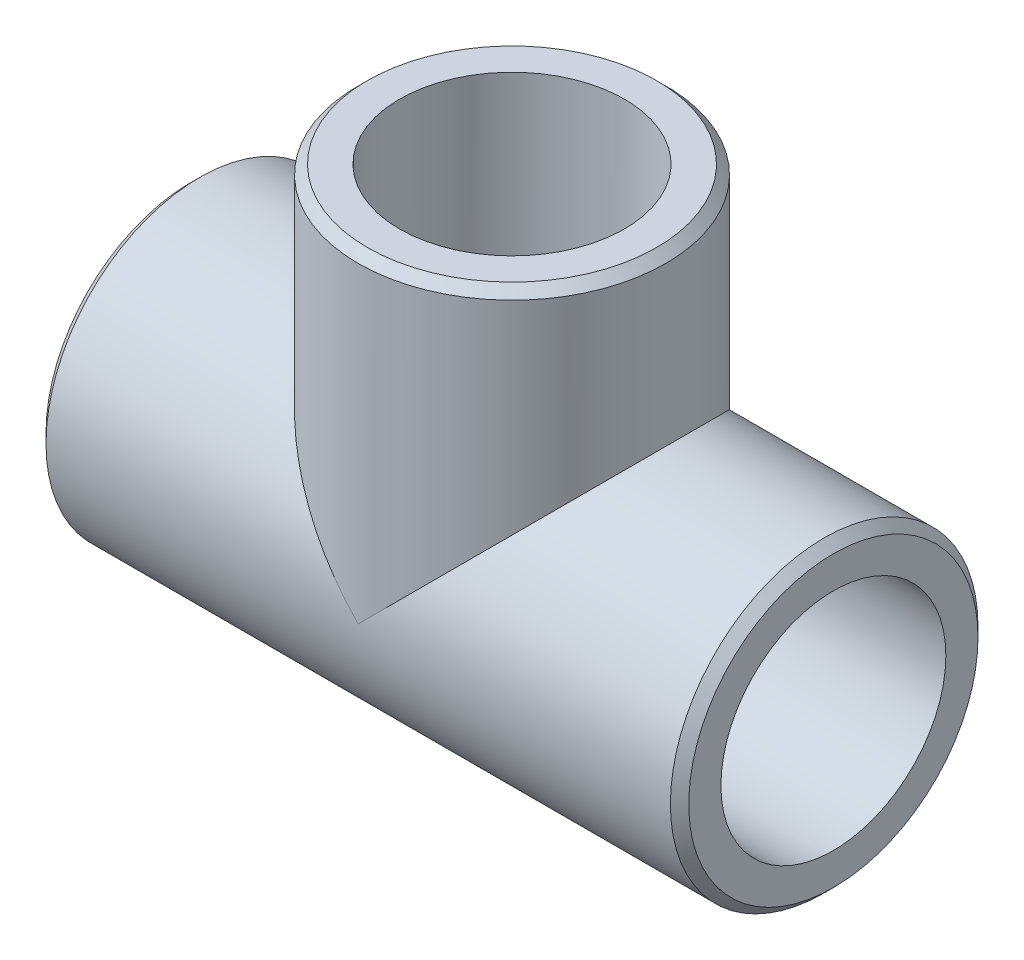
ISO-10303-21;
HEADER;
FILE_DESCRIPTION(('STEP AP214'),'2;1');
FILE_NAME('part.step','',(''),(''),'','','');
FILE_SCHEMA(('AUTOMOTIVE_DESIGN { 1 0 10303 214 1 1 1 1 }'));
ENDSEC;
DATA;
#1=APPLICATION_CONTEXT('core data for automotive mechanical design processes');
#2=APPLICATION_PROTOCOL_DEFINITION('international standard','automotive_design',2000,#1);
#3=PRODUCT_CONTEXT('',#1,'mechanical');
#4=PRODUCT('Part','Part','',(#3));
#5=PRODUCT_RELATED_PRODUCT_CATEGORY('part','',(#4));
#6=PRODUCT_DEFINITION_FORMATION('','',#4);
#7=PRODUCT_DEFINITION_CONTEXT('part definition',#1,'design');
#8=PRODUCT_DEFINITION('design','',#6,#7);
#9=PRODUCT_DEFINITION_SHAPE('','',#8);
#10=(LENGTH_UNIT() NAMED_UNIT(*) SI_UNIT(.MILLI.,.METRE.));
#11=(NAMED_UNIT(*) PLANE_ANGLE_UNIT() SI_UNIT($,.RADIAN.));
#12=(NAMED_UNIT(*) SI_UNIT($,.STERADIAN.) SOLID_ANGLE_UNIT());
#13=UNCERTAINTY_MEASURE_WITH_UNIT(LENGTH_MEASURE(1.E-05),#10,'distance_accuracy_value','');
#14=(GEOMETRIC_REPRESENTATION_CONTEXT(3) GLOBAL_UNCERTAINTY_ASSIGNED_CONTEXT((#13)) GLOBAL_UNIT_ASSIGNED_CONTEXT((#10,
#11,#12)) REPRESENTATION_CONTEXT('',''));
#15=CARTESIAN_POINT('',(0.,0.,0.));
#16=DIRECTION('',(0.,0.,1.));
#17=DIRECTION('',(1.,0.,0.));
#18=AXIS2_PLACEMENT_3D('',#15,#16,#17);
#19=CARTESIAN_POINT('',(-35.,0.,0.));
#20=DIRECTION('',(-1.,0.,0.));
#21=DIRECTION('',(0.,0.,-1.));
#22=AXIS2_PLACEMENT_3D('',#19,#20,#21);
#23=PLANE('',#22);
#24=CARTESIAN_POINT('',(-35.,0.,0.));
#25=DIRECTION('',(-1.,0.,0.));
#26=DIRECTION('',(0.,0.,1.));
#27=AXIS2_PLACEMENT_3D('',#24,#25,#26);
#28=CIRCLE('',#27,15.75);
#29=CARTESIAN_POINT('',(-35.,0.,15.75));
#30=VERTEX_POINT('',#29);
#31=EDGE_CURVE('E91',#30,#30,#28,.T.);
#32=ORIENTED_EDGE('',*,*,#31,.T.);
#33=EDGE_LOOP('',(#32));
#34=FACE_BOUND('',#33,.T.);
#35=CARTESIAN_POINT('',(-35.,0.,0.));
#36=DIRECTION('',(-1.,0.,0.));
#37=DIRECTION('',(0.,0.,1.));
#38=AXIS2_PLACEMENT_3D('',#35,#36,#37);
#39=CIRCLE('',#38,12.25);
#40=CARTESIAN_POINT('',(-35.,0.,12.25));
#41=VERTEX_POINT('',#40);
#42=EDGE_CURVE('E72',#41,#41,#39,.F.);
#43=ORIENTED_EDGE('',*,*,#42,.T.);
#44=EDGE_LOOP('',(#43));
#45=FACE_BOUND('',#44,.T.);
#46=ADVANCED_FACE('F37',(#34,#45),#23,.T.);
#47=CARTESIAN_POINT('',(35.,0.,0.));
#48=DIRECTION('',(-1.,0.,0.));
#49=DIRECTION('',(0.,0.,1.));
#50=AXIS2_PLACEMENT_3D('',#47,#48,#49);
#51=CYLINDRICAL_SURFACE('',#50,16.75);
#52=CARTESIAN_POINT('',(34.,0.,0.));
#53=DIRECTION('',(1.,0.,0.));
#54=DIRECTION('',(0.,0.,-1.));
#55=AXIS2_PLACEMENT_3D('',#52,#53,#54);
#56=CIRCLE('',#55,16.75);
#57=CARTESIAN_POINT('',(34.,0.,-16.75));
#58=VERTEX_POINT('',#57);
#59=EDGE_CURVE('E88',#58,#58,#56,.F.);
#60=ORIENTED_EDGE('',*,*,#59,.T.);
#61=EDGE_LOOP('',(#60));
#62=FACE_BOUND('',#61,.T.);
#63=CARTESIAN_POINT('',(-34.,0.,0.));
#64=DIRECTION('',(-1.,0.,0.));
#65=DIRECTION('',(0.,0.,1.));
#66=AXIS2_PLACEMENT_3D('',#63,#64,#65);
#67=CIRCLE('',#66,16.75);
#68=CARTESIAN_POINT('',(-34.,0.,16.75));
#69=VERTEX_POINT('',#68);
#70=EDGE_CURVE('E85',#69,#69,#67,.F.);
#71=ORIENTED_EDGE('',*,*,#70,.T.);
#72=EDGE_LOOP('',(#71));
#73=FACE_BOUND('',#72,.T.);
#74=CARTESIAN_POINT('',(0.,0.,0.));
#75=DIRECTION('',(-0.707106781186547,-0.707106781186547,0.));
#76=DIRECTION('',(-0.707106781186547,0.707106781186547,0.));
#77=AXIS2_PLACEMENT_3D('',#74,#75,#76);
#78=ELLIPSE('',#77,23.6880771697493,16.75);
#79=CARTESIAN_POINT('',(0.,0.,-16.75));
#80=VERTEX_POINT('',#79);
#81=CARTESIAN_POINT('',(0.,0.,16.75));
#82=VERTEX_POINT('',#81);
#83=EDGE_CURVE('E54',#80,#82,#78,.F.);
#84=ORIENTED_EDGE('',*,*,#83,.F.);
#85=CARTESIAN_POINT('',(0.,0.,0.));
#86=DIRECTION('',(-0.707106781186547,0.707106781186547,0.));
#87=DIRECTION('',(-0.707106781186547,-0.707106781186547,0.));
#88=AXIS2_PLACEMENT_3D('',#85,#86,#87);
#89=ELLIPSE('',#88,23.6880771697493,16.75);
#90=EDGE_CURVE('E51',#82,#80,#89,.T.);
#91=ORIENTED_EDGE('',*,*,#90,.F.);
#92=EDGE_LOOP('',(#84,#91));
#93=FACE_BOUND('',#92,.T.);
#94=ADVANCED_FACE('F109',(#62,#73,#93),#51,.T.);
#95=CARTESIAN_POINT('',(35.,0.,0.));
#96=DIRECTION('',(1.,0.,0.));
#97=DIRECTION('',(0.,0.,-1.));
#98=AXIS2_PLACEMENT_3D('',#95,#96,#97);
#99=PLANE('',#98);
#100=CARTESIAN_POINT('',(35.,0.,0.));
#101=DIRECTION('',(1.,0.,0.));
#102=DIRECTION('',(0.,0.,-1.));
#103=AXIS2_PLACEMENT_3D('',#100,#101,#102);
#104=CIRCLE('',#103,15.75);
#105=CARTESIAN_POINT('',(35.,0.,-15.75));
#106=VERTEX_POINT('',#105);
#107=EDGE_CURVE('E82',#106,#106,#104,.T.);
#108=ORIENTED_EDGE('',*,*,#107,.T.);
#109=EDGE_LOOP('',(#108));
#110=FACE_BOUND('',#109,.T.);
#111=CARTESIAN_POINT('',(35.,0.,0.));
#112=DIRECTION('',(1.,0.,0.));
#113=DIRECTION('',(0.,0.,-1.));
#114=AXIS2_PLACEMENT_3D('',#111,#112,#113);
#115=CIRCLE('',#114,12.25);
#116=CARTESIAN_POINT('',(35.,0.,-12.25));
#117=VERTEX_POINT('',#116);
#118=EDGE_CURVE('E69',#117,#117,#115,.T.);
#119=ORIENTED_EDGE('',*,*,#118,.F.);
#120=EDGE_LOOP('',(#119));
#121=FACE_BOUND('',#120,.T.);
#122=ADVANCED_FACE('F115',(#110,#121),#99,.T.);
#123=CARTESIAN_POINT('',(0.,35.,0.));
#124=DIRECTION('',(0.,-1.,0.));
#125=DIRECTION('',(0.,0.,-1.));
#126=AXIS2_PLACEMENT_3D('',#123,#124,#125);
#127=CYLINDRICAL_SURFACE('',#126,16.75);
#128=CARTESIAN_POINT('',(0.,34.,0.));
#129=DIRECTION('',(0.,1.,0.));
#130=DIRECTION('',(0.,0.,1.));
#131=AXIS2_PLACEMENT_3D('',#128,#129,#130);
#132=CIRCLE('',#131,16.75);
#133=CARTESIAN_POINT('',(0.,34.,16.75));
#134=VERTEX_POINT('',#133);
#135=EDGE_CURVE('E11',#134,#134,#132,.F.);
#136=ORIENTED_EDGE('',*,*,#135,.T.);
#137=EDGE_LOOP('',(#136));
#138=FACE_BOUND('',#137,.T.);
#139=ORIENTED_EDGE('',*,*,#90,.T.);
#140=ORIENTED_EDGE('',*,*,#83,.T.);
#141=EDGE_LOOP('',(#139,#140));
#142=FACE_BOUND('',#141,.T.);
#143=ADVANCED_FACE('F121',(#138,#142),#127,.T.);
#144=CARTESIAN_POINT('',(0.,35.,0.));
#145=DIRECTION('',(0.,1.,0.));
#146=DIRECTION('',(0.,0.,1.));
#147=AXIS2_PLACEMENT_3D('',#144,#145,#146);
#148=PLANE('',#147);
#149=CARTESIAN_POINT('',(0.,35.,0.));
#150=DIRECTION('',(0.,1.,0.));
#151=DIRECTION('',(0.,0.,1.));
#152=AXIS2_PLACEMENT_3D('',#149,#150,#151);
#153=CIRCLE('',#152,15.75);
#154=CARTESIAN_POINT('',(0.,35.,15.75));
#155=VERTEX_POINT('',#154);
#156=EDGE_CURVE('E45',#155,#155,#153,.T.);
#157=ORIENTED_EDGE('',*,*,#156,.T.);
#158=EDGE_LOOP('',(#157));
#159=FACE_BOUND('',#158,.T.);
#160=CARTESIAN_POINT('',(0.,35.,0.));
#161=DIRECTION('',(0.,1.,0.));
#162=DIRECTION('',(0.,0.,1.));
#163=AXIS2_PLACEMENT_3D('',#160,#161,#162);
#164=CIRCLE('',#163,12.25);
#165=CARTESIAN_POINT('',(0.,35.,12.25));
#166=VERTEX_POINT('',#165);
#167=EDGE_CURVE('E76',#166,#166,#164,.T.);
#168=ORIENTED_EDGE('',*,*,#167,.F.);
#169=EDGE_LOOP('',(#168));
#170=FACE_BOUND('',#169,.T.);
#171=ADVANCED_FACE('F96',(#159,#170),#148,.T.);
#172=CARTESIAN_POINT('',(35.,0.,0.));
#173=DIRECTION('',(-1.,0.,0.));
#174=DIRECTION('',(0.,0.,1.));
#175=AXIS2_PLACEMENT_3D('',#172,#173,#174);
#176=CYLINDRICAL_SURFACE('',#175,12.25);
#177=ORIENTED_EDGE('',*,*,#42,.F.);
#178=EDGE_LOOP('',(#177));
#179=FACE_BOUND('',#178,.T.);
#180=ORIENTED_EDGE('',*,*,#118,.T.);
#181=EDGE_LOOP('',(#180));
#182=FACE_BOUND('',#181,.T.);
#183=CARTESIAN_POINT('',(0.,0.,0.));
#184=DIRECTION('',(-0.707106781186547,-0.707106781186547,0.));
#185=DIRECTION('',(-0.707106781186547,0.707106781186547,0.));
#186=AXIS2_PLACEMENT_3D('',#183,#184,#185);
#187=ELLIPSE('',#186,17.3241161390704,12.25);
#188=CARTESIAN_POINT('',(0.,0.,-12.25));
#189=VERTEX_POINT('',#188);
#190=CARTESIAN_POINT('',(0.,0.,12.25));
#191=VERTEX_POINT('',#190);
#192=EDGE_CURVE('E62',#189,#191,#187,.F.);
#193=ORIENTED_EDGE('',*,*,#192,.T.);
#194=CARTESIAN_POINT('',(0.,0.,0.));
#195=DIRECTION('',(-0.707106781186547,0.707106781186547,0.));
#196=DIRECTION('',(-0.707106781186547,-0.707106781186547,0.));
#197=AXIS2_PLACEMENT_3D('',#194,#195,#196);
#198=ELLIPSE('',#197,17.3241161390704,12.25);
#199=EDGE_CURVE('E65',#191,#189,#198,.T.);
#200=ORIENTED_EDGE('',*,*,#199,.T.);
#201=EDGE_LOOP('',(#193,#200));
#202=FACE_BOUND('',#201,.T.);
#203=ADVANCED_FACE('F68',(#179,#182,#202),#176,.F.);
#204=CARTESIAN_POINT('',(0.,35.,0.));
#205=DIRECTION('',(0.,-1.,0.));
#206=DIRECTION('',(0.,0.,-1.));
#207=AXIS2_PLACEMENT_3D('',#204,#205,#206);
#208=CYLINDRICAL_SURFACE('',#207,12.25);
#209=ORIENTED_EDGE('',*,*,#167,.T.);
#210=EDGE_LOOP('',(#209));
#211=FACE_BOUND('',#210,.T.);
#212=ORIENTED_EDGE('',*,*,#199,.F.);
#213=ORIENTED_EDGE('',*,*,#192,.F.);
#214=EDGE_LOOP('',(#212,#213));
#215=FACE_BOUND('',#214,.T.);
#216=ADVANCED_FACE('F64',(#211,#215),#208,.F.);
#217=CARTESIAN_POINT('',(35.,0.,0.));
#218=DIRECTION('',(-1.,0.,0.));
#219=DIRECTION('',(0.,0.,1.));
#220=AXIS2_PLACEMENT_3D('',#217,#218,#219);
#221=CONICAL_SURFACE('',#220,15.75,0.785398163397448);
#222=ORIENTED_EDGE('',*,*,#59,.F.);
#223=EDGE_LOOP('',(#222));
#224=FACE_BOUND('',#223,.T.);
#225=ORIENTED_EDGE('',*,*,#107,.F.);
#226=EDGE_LOOP('',(#225));
#227=FACE_BOUND('',#226,.T.);
#228=ADVANCED_FACE('F105',(#224,#227),#221,.T.);
#229=CARTESIAN_POINT('',(-34.,0.,0.));
#230=DIRECTION('',(1.,0.,0.));
#231=DIRECTION('',(0.,0.,-1.));
#232=AXIS2_PLACEMENT_3D('',#229,#230,#231);
#233=CONICAL_SURFACE('',#232,16.75,0.785398163397459);
#234=ORIENTED_EDGE('',*,*,#31,.F.);
#235=EDGE_LOOP('',(#234));
#236=FACE_BOUND('',#235,.T.);
#237=ORIENTED_EDGE('',*,*,#70,.F.);
#238=EDGE_LOOP('',(#237));
#239=FACE_BOUND('',#238,.T.);
#240=ADVANCED_FACE('F100',(#236,#239),#233,.T.);
#241=CARTESIAN_POINT('',(0.,35.,0.));
#242=DIRECTION('',(0.,-1.,0.));
#243=DIRECTION('',(0.,0.,-1.));
#244=AXIS2_PLACEMENT_3D('',#241,#242,#243);
#245=CONICAL_SURFACE('',#244,15.75,0.785398163397448);
#246=ORIENTED_EDGE('',*,*,#135,.F.);
#247=EDGE_LOOP('',(#246));
#248=FACE_BOUND('',#247,.T.);
#249=ORIENTED_EDGE('',*,*,#156,.F.);
#250=EDGE_LOOP('',(#249));
#251=FACE_BOUND('',#250,.T.);
#252=ADVANCED_FACE('F39',(#248,#251),#245,.T.);
#253=CLOSED_SHELL('',(#46,#94,#122,#143,#171,#203,#216,#228,#240,#252));
#254=MANIFOLD_SOLID_BREP('B2',#253);
#255=ADVANCED_BREP_SHAPE_REPRESENTATION('',(#18,#254),#14);
#256=SHAPE_DEFINITION_REPRESENTATION(#9,#255);
ENDSEC;
END-ISO-10303-21;
